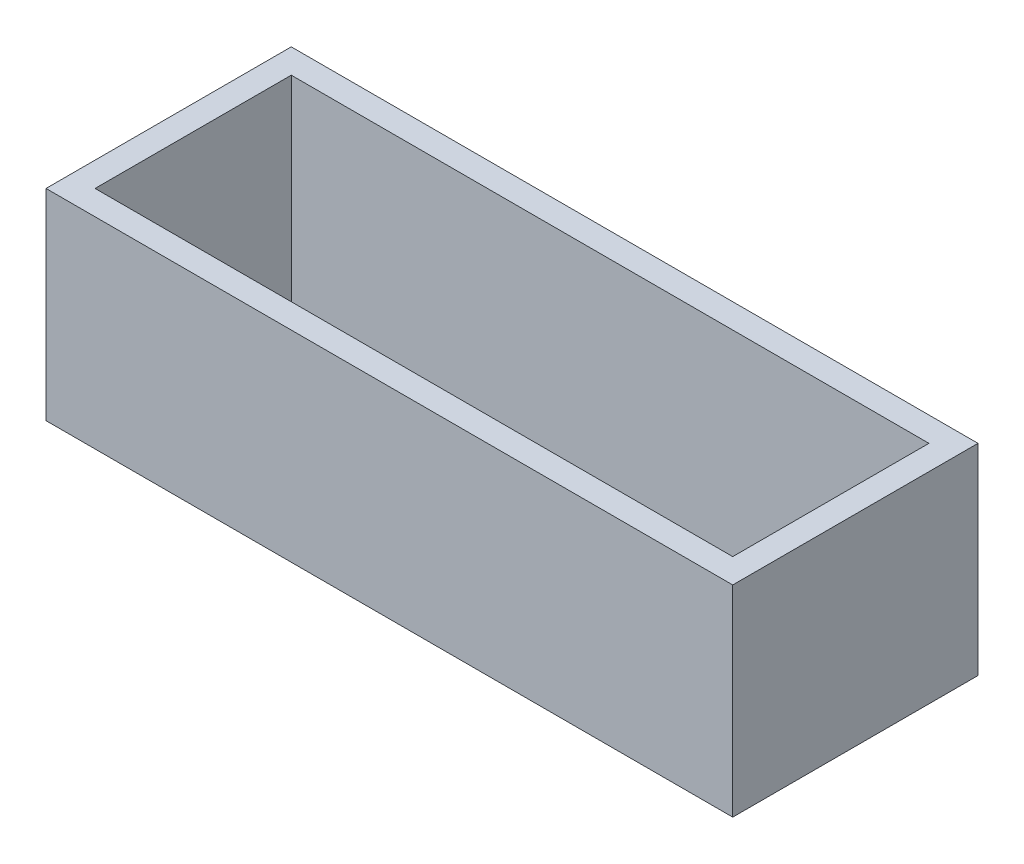
ISO-10303-21;
HEADER;
FILE_DESCRIPTION(('STEP AP214'),'2;1');
FILE_NAME('part.step','',(''),(''),'','','');
FILE_SCHEMA(('AUTOMOTIVE_DESIGN { 1 0 10303 214 1 1 1 1 }'));
ENDSEC;
DATA;
#1=APPLICATION_CONTEXT('core data for automotive mechanical design processes');
#2=APPLICATION_PROTOCOL_DEFINITION('international standard','automotive_design',2000,#1);
#3=PRODUCT_CONTEXT('',#1,'mechanical');
#4=PRODUCT('Part','Part','',(#3));
#5=PRODUCT_RELATED_PRODUCT_CATEGORY('part','',(#4));
#6=PRODUCT_DEFINITION_FORMATION('','',#4);
#7=PRODUCT_DEFINITION_CONTEXT('part definition',#1,'design');
#8=PRODUCT_DEFINITION('design','',#6,#7);
#9=PRODUCT_DEFINITION_SHAPE('','',#8);
#10=(LENGTH_UNIT() NAMED_UNIT(*) SI_UNIT(.MILLI.,.METRE.));
#11=(NAMED_UNIT(*) PLANE_ANGLE_UNIT() SI_UNIT($,.RADIAN.));
#12=(NAMED_UNIT(*) SI_UNIT($,.STERADIAN.) SOLID_ANGLE_UNIT());
#13=UNCERTAINTY_MEASURE_WITH_UNIT(LENGTH_MEASURE(1.E-05),#10,'distance_accuracy_value','');
#14=(GEOMETRIC_REPRESENTATION_CONTEXT(3) GLOBAL_UNCERTAINTY_ASSIGNED_CONTEXT((#13)) GLOBAL_UNIT_ASSIGNED_CONTEXT((#10,
#11,#12)) REPRESENTATION_CONTEXT('',''));
#15=CARTESIAN_POINT('',(0.,0.,0.));
#16=DIRECTION('',(0.,0.,1.));
#17=DIRECTION('',(1.,0.,0.));
#18=AXIS2_PLACEMENT_3D('',#15,#16,#17);
#19=CARTESIAN_POINT('',(177.8,2.54,63.5));
#20=DIRECTION('',(-1.,0.,0.));
#21=DIRECTION('',(0.,0.,1.));
#22=AXIS2_PLACEMENT_3D('',#19,#20,#21);
#23=PLANE('',#22);
#24=DIRECTION('',(0.,0.,-1.));
#25=VECTOR('',#24,1.);
#26=CARTESIAN_POINT('',(177.8,0.,63.5));
#27=LINE('',#26,#25);
#28=CARTESIAN_POINT('',(177.8,0.,63.5));
#29=VERTEX_POINT('',#28);
#30=CARTESIAN_POINT('',(177.8,0.,-63.5));
#31=VERTEX_POINT('',#30);
#32=EDGE_CURVE('E151',#29,#31,#27,.T.);
#33=ORIENTED_EDGE('',*,*,#32,.T.);
#34=DIRECTION('',(0.,-1.,0.));
#35=VECTOR('',#34,1.);
#36=CARTESIAN_POINT('',(177.8,2.54,-63.5));
#37=LINE('',#36,#35);
#38=CARTESIAN_POINT('',(177.8,104.14,-63.5));
#39=VERTEX_POINT('',#38);
#40=EDGE_CURVE('E11',#39,#31,#37,.T.);
#41=ORIENTED_EDGE('',*,*,#40,.F.);
#42=DIRECTION('',(0.,0.,-1.));
#43=VECTOR('',#42,1.);
#44=CARTESIAN_POINT('',(177.8,104.14,63.5));
#45=LINE('',#44,#43);
#46=CARTESIAN_POINT('',(177.8,104.14,63.5));
#47=VERTEX_POINT('',#46);
#48=EDGE_CURVE('E116',#47,#39,#45,.T.);
#49=ORIENTED_EDGE('',*,*,#48,.F.);
#50=DIRECTION('',(0.,-1.,0.));
#51=VECTOR('',#50,1.);
#52=CARTESIAN_POINT('',(177.8,2.54,63.5));
#53=LINE('',#52,#51);
#54=EDGE_CURVE('E159',#47,#29,#53,.T.);
#55=ORIENTED_EDGE('',*,*,#54,.T.);
#56=EDGE_LOOP('',(#33,#41,#49,#55));
#57=FACE_BOUND('',#56,.T.);
#58=ADVANCED_FACE('F34',(#57),#23,.F.);
#59=CARTESIAN_POINT('',(-177.8,2.54,-63.5));
#60=DIRECTION('',(0.,0.,1.));
#61=DIRECTION('',(1.,0.,0.));
#62=AXIS2_PLACEMENT_3D('',#59,#60,#61);
#63=PLANE('',#62);
#64=DIRECTION('',(-1.,0.,0.));
#65=VECTOR('',#64,1.);
#66=CARTESIAN_POINT('',(-177.8,0.,-63.5));
#67=LINE('',#66,#65);
#68=CARTESIAN_POINT('',(-177.8,0.,-63.5));
#69=VERTEX_POINT('',#68);
#70=EDGE_CURVE('E154',#31,#69,#67,.T.);
#71=ORIENTED_EDGE('',*,*,#70,.T.);
#72=DIRECTION('',(0.,-1.,0.));
#73=VECTOR('',#72,1.);
#74=CARTESIAN_POINT('',(-177.8,2.54,-63.5));
#75=LINE('',#74,#73);
#76=CARTESIAN_POINT('',(-177.8,104.14,-63.5));
#77=VERTEX_POINT('',#76);
#78=EDGE_CURVE('E41',#77,#69,#75,.T.);
#79=ORIENTED_EDGE('',*,*,#78,.F.);
#80=DIRECTION('',(-1.,0.,0.));
#81=VECTOR('',#80,1.);
#82=CARTESIAN_POINT('',(-177.8,104.14,-63.5));
#83=LINE('',#82,#81);
#84=EDGE_CURVE('E142',#39,#77,#83,.T.);
#85=ORIENTED_EDGE('',*,*,#84,.F.);
#86=ORIENTED_EDGE('',*,*,#40,.T.);
#87=EDGE_LOOP('',(#71,#79,#85,#86));
#88=FACE_BOUND('',#87,.T.);
#89=ADVANCED_FACE('F177',(#88),#63,.F.);
#90=CARTESIAN_POINT('',(-177.8,2.54,63.5));
#91=DIRECTION('',(1.,0.,0.));
#92=DIRECTION('',(0.,0.,-1.));
#93=AXIS2_PLACEMENT_3D('',#90,#91,#92);
#94=PLANE('',#93);
#95=DIRECTION('',(0.,0.,1.));
#96=VECTOR('',#95,1.);
#97=CARTESIAN_POINT('',(-177.8,0.,63.5));
#98=LINE('',#97,#96);
#99=CARTESIAN_POINT('',(-177.8,0.,63.5));
#100=VERTEX_POINT('',#99);
#101=EDGE_CURVE('E156',#69,#100,#98,.T.);
#102=ORIENTED_EDGE('',*,*,#101,.T.);
#103=DIRECTION('',(0.,-1.,0.));
#104=VECTOR('',#103,1.);
#105=CARTESIAN_POINT('',(-177.8,2.54,63.5));
#106=LINE('',#105,#104);
#107=CARTESIAN_POINT('',(-177.8,104.14,63.5));
#108=VERTEX_POINT('',#107);
#109=EDGE_CURVE('E161',#108,#100,#106,.T.);
#110=ORIENTED_EDGE('',*,*,#109,.F.);
#111=DIRECTION('',(0.,0.,1.));
#112=VECTOR('',#111,1.);
#113=CARTESIAN_POINT('',(-177.8,104.14,63.5));
#114=LINE('',#113,#112);
#115=EDGE_CURVE('E145',#77,#108,#114,.T.);
#116=ORIENTED_EDGE('',*,*,#115,.F.);
#117=ORIENTED_EDGE('',*,*,#78,.T.);
#118=EDGE_LOOP('',(#102,#110,#116,#117));
#119=FACE_BOUND('',#118,.T.);
#120=ADVANCED_FACE('F166',(#119),#94,.F.);
#121=CARTESIAN_POINT('',(-177.8,2.54,63.5));
#122=DIRECTION('',(0.,0.,-1.));
#123=DIRECTION('',(-1.,0.,0.));
#124=AXIS2_PLACEMENT_3D('',#121,#122,#123);
#125=PLANE('',#124);
#126=DIRECTION('',(1.,0.,0.));
#127=VECTOR('',#126,1.);
#128=CARTESIAN_POINT('',(-177.8,0.,63.5));
#129=LINE('',#128,#127);
#130=EDGE_CURVE('E56',#100,#29,#129,.T.);
#131=ORIENTED_EDGE('',*,*,#130,.T.);
#132=ORIENTED_EDGE('',*,*,#54,.F.);
#133=DIRECTION('',(1.,0.,0.));
#134=VECTOR('',#133,1.);
#135=CARTESIAN_POINT('',(-177.8,104.14,63.5));
#136=LINE('',#135,#134);
#137=EDGE_CURVE('E148',#108,#47,#136,.T.);
#138=ORIENTED_EDGE('',*,*,#137,.F.);
#139=ORIENTED_EDGE('',*,*,#109,.T.);
#140=EDGE_LOOP('',(#131,#132,#138,#139));
#141=FACE_BOUND('',#140,.T.);
#142=ADVANCED_FACE('F175',(#141),#125,.F.);
#143=CARTESIAN_POINT('',(0.,0.,0.));
#144=DIRECTION('',(0.,-1.,0.));
#145=DIRECTION('',(0.,0.,-1.));
#146=AXIS2_PLACEMENT_3D('',#143,#144,#145);
#147=PLANE('',#146);
#148=ORIENTED_EDGE('',*,*,#32,.F.);
#149=ORIENTED_EDGE('',*,*,#130,.F.);
#150=ORIENTED_EDGE('',*,*,#101,.F.);
#151=ORIENTED_EDGE('',*,*,#70,.F.);
#152=EDGE_LOOP('',(#148,#149,#150,#151));
#153=FACE_BOUND('',#152,.T.);
#154=ADVANCED_FACE('F171',(#153),#147,.T.);
#155=CARTESIAN_POINT('',(0.,104.14,0.));
#156=DIRECTION('',(0.,-1.,0.));
#157=DIRECTION('',(0.,0.,-1.));
#158=AXIS2_PLACEMENT_3D('',#155,#156,#157);
#159=PLANE('',#158);
#160=ORIENTED_EDGE('',*,*,#48,.T.);
#161=ORIENTED_EDGE('',*,*,#84,.T.);
#162=ORIENTED_EDGE('',*,*,#115,.T.);
#163=ORIENTED_EDGE('',*,*,#137,.T.);
#164=EDGE_LOOP('',(#160,#161,#162,#163));
#165=FACE_BOUND('',#164,.T.);
#166=DIRECTION('',(0.,0.,-1.));
#167=VECTOR('',#166,1.);
#168=CARTESIAN_POINT('',(165.1,104.14,50.8));
#169=LINE('',#168,#167);
#170=CARTESIAN_POINT('',(165.1,104.14,50.8));
#171=VERTEX_POINT('',#170);
#172=CARTESIAN_POINT('',(165.1,104.14,-50.8));
#173=VERTEX_POINT('',#172);
#174=EDGE_CURVE('E100',#171,#173,#169,.T.);
#175=ORIENTED_EDGE('',*,*,#174,.F.);
#176=DIRECTION('',(1.,0.,0.));
#177=VECTOR('',#176,1.);
#178=CARTESIAN_POINT('',(-165.1,104.14,50.8));
#179=LINE('',#178,#177);
#180=CARTESIAN_POINT('',(-165.1,104.14,50.8));
#181=VERTEX_POINT('',#180);
#182=EDGE_CURVE('E124',#181,#171,#179,.T.);
#183=ORIENTED_EDGE('',*,*,#182,.F.);
#184=DIRECTION('',(0.,0.,1.));
#185=VECTOR('',#184,1.);
#186=CARTESIAN_POINT('',(-165.1,104.14,50.8));
#187=LINE('',#186,#185);
#188=CARTESIAN_POINT('',(-165.1,104.14,-50.8));
#189=VERTEX_POINT('',#188);
#190=EDGE_CURVE('E122',#189,#181,#187,.T.);
#191=ORIENTED_EDGE('',*,*,#190,.F.);
#192=DIRECTION('',(-1.,0.,0.));
#193=VECTOR('',#192,1.);
#194=CARTESIAN_POINT('',(-165.1,104.14,-50.8));
#195=LINE('',#194,#193);
#196=EDGE_CURVE('E108',#173,#189,#195,.T.);
#197=ORIENTED_EDGE('',*,*,#196,.F.);
#198=EDGE_LOOP('',(#175,#183,#191,#197));
#199=FACE_BOUND('',#198,.T.);
#200=ADVANCED_FACE('F120',(#165,#199),#159,.F.);
#201=CARTESIAN_POINT('',(165.1,104.14,50.8));
#202=DIRECTION('',(-1.,0.,0.));
#203=DIRECTION('',(0.,0.,1.));
#204=AXIS2_PLACEMENT_3D('',#201,#202,#203);
#205=PLANE('',#204);
#206=DIRECTION('',(0.,0.,-1.));
#207=VECTOR('',#206,1.);
#208=CARTESIAN_POINT('',(165.1,2.54,50.8));
#209=LINE('',#208,#207);
#210=CARTESIAN_POINT('',(165.1,2.54,50.8));
#211=VERTEX_POINT('',#210);
#212=CARTESIAN_POINT('',(165.1,2.54,-50.8));
#213=VERTEX_POINT('',#212);
#214=EDGE_CURVE('E128',#211,#213,#209,.T.);
#215=ORIENTED_EDGE('',*,*,#214,.F.);
#216=DIRECTION('',(0.,-1.,0.));
#217=VECTOR('',#216,1.);
#218=CARTESIAN_POINT('',(165.1,104.14,50.8));
#219=LINE('',#218,#217);
#220=EDGE_CURVE('E48',#171,#211,#219,.T.);
#221=ORIENTED_EDGE('',*,*,#220,.F.);
#222=ORIENTED_EDGE('',*,*,#174,.T.);
#223=DIRECTION('',(0.,-1.,0.));
#224=VECTOR('',#223,1.);
#225=CARTESIAN_POINT('',(165.1,104.14,-50.8));
#226=LINE('',#225,#224);
#227=EDGE_CURVE('E103',#173,#213,#226,.T.);
#228=ORIENTED_EDGE('',*,*,#227,.T.);
#229=EDGE_LOOP('',(#215,#221,#222,#228));
#230=FACE_BOUND('',#229,.T.);
#231=ADVANCED_FACE('F102',(#230),#205,.T.);
#232=CARTESIAN_POINT('',(-165.1,104.14,-50.8));
#233=DIRECTION('',(0.,0.,1.));
#234=DIRECTION('',(1.,0.,0.));
#235=AXIS2_PLACEMENT_3D('',#232,#233,#234);
#236=PLANE('',#235);
#237=DIRECTION('',(-1.,0.,0.));
#238=VECTOR('',#237,1.);
#239=CARTESIAN_POINT('',(-165.1,2.54,-50.8));
#240=LINE('',#239,#238);
#241=CARTESIAN_POINT('',(-165.1,2.54,-50.8));
#242=VERTEX_POINT('',#241);
#243=EDGE_CURVE('E115',#213,#242,#240,.T.);
#244=ORIENTED_EDGE('',*,*,#243,.F.);
#245=ORIENTED_EDGE('',*,*,#227,.F.);
#246=ORIENTED_EDGE('',*,*,#196,.T.);
#247=DIRECTION('',(0.,-1.,0.));
#248=VECTOR('',#247,1.);
#249=CARTESIAN_POINT('',(-165.1,104.14,-50.8));
#250=LINE('',#249,#248);
#251=EDGE_CURVE('E117',#189,#242,#250,.T.);
#252=ORIENTED_EDGE('',*,*,#251,.T.);
#253=EDGE_LOOP('',(#244,#245,#246,#252));
#254=FACE_BOUND('',#253,.T.);
#255=ADVANCED_FACE('F112',(#254),#236,.T.);
#256=CARTESIAN_POINT('',(-165.1,104.14,50.8));
#257=DIRECTION('',(1.,0.,0.));
#258=DIRECTION('',(0.,0.,-1.));
#259=AXIS2_PLACEMENT_3D('',#256,#257,#258);
#260=PLANE('',#259);
#261=DIRECTION('',(0.,0.,1.));
#262=VECTOR('',#261,1.);
#263=CARTESIAN_POINT('',(-165.1,2.54,50.8));
#264=LINE('',#263,#262);
#265=CARTESIAN_POINT('',(-165.1,2.54,50.8));
#266=VERTEX_POINT('',#265);
#267=EDGE_CURVE('E131',#242,#266,#264,.T.);
#268=ORIENTED_EDGE('',*,*,#267,.F.);
#269=ORIENTED_EDGE('',*,*,#251,.F.);
#270=ORIENTED_EDGE('',*,*,#190,.T.);
#271=DIRECTION('',(0.,-1.,0.));
#272=VECTOR('',#271,1.);
#273=CARTESIAN_POINT('',(-165.1,104.14,50.8));
#274=LINE('',#273,#272);
#275=EDGE_CURVE('E137',#181,#266,#274,.T.);
#276=ORIENTED_EDGE('',*,*,#275,.T.);
#277=EDGE_LOOP('',(#268,#269,#270,#276));
#278=FACE_BOUND('',#277,.T.);
#279=ADVANCED_FACE('F200',(#278),#260,.T.);
#280=CARTESIAN_POINT('',(-165.1,104.14,50.8));
#281=DIRECTION('',(0.,0.,-1.));
#282=DIRECTION('',(-1.,0.,0.));
#283=AXIS2_PLACEMENT_3D('',#280,#281,#282);
#284=PLANE('',#283);
#285=DIRECTION('',(1.,0.,0.));
#286=VECTOR('',#285,1.);
#287=CARTESIAN_POINT('',(-165.1,2.54,50.8));
#288=LINE('',#287,#286);
#289=EDGE_CURVE('E109',#266,#211,#288,.T.);
#290=ORIENTED_EDGE('',*,*,#289,.F.);
#291=ORIENTED_EDGE('',*,*,#275,.F.);
#292=ORIENTED_EDGE('',*,*,#182,.T.);
#293=ORIENTED_EDGE('',*,*,#220,.T.);
#294=EDGE_LOOP('',(#290,#291,#292,#293));
#295=FACE_BOUND('',#294,.T.);
#296=ADVANCED_FACE('F192',(#295),#284,.T.);
#297=CARTESIAN_POINT('',(0.,2.54,0.));
#298=DIRECTION('',(0.,-1.,0.));
#299=DIRECTION('',(0.,0.,-1.));
#300=AXIS2_PLACEMENT_3D('',#297,#298,#299);
#301=PLANE('',#300);
#302=ORIENTED_EDGE('',*,*,#289,.T.);
#303=ORIENTED_EDGE('',*,*,#214,.T.);
#304=ORIENTED_EDGE('',*,*,#243,.T.);
#305=ORIENTED_EDGE('',*,*,#267,.T.);
#306=EDGE_LOOP('',(#302,#303,#304,#305));
#307=FACE_BOUND('',#306,.T.);
#308=ADVANCED_FACE('F189',(#307),#301,.F.);
#309=CLOSED_SHELL('',(#58,#89,#120,#142,#154,#200,#231,#255,#279,#296,#308));
#310=MANIFOLD_SOLID_BREP('B2',#309);
#311=ADVANCED_BREP_SHAPE_REPRESENTATION('',(#18,#310),#14);
#312=SHAPE_DEFINITION_REPRESENTATION(#9,#311);
ENDSEC;
END-ISO-10303-21;
